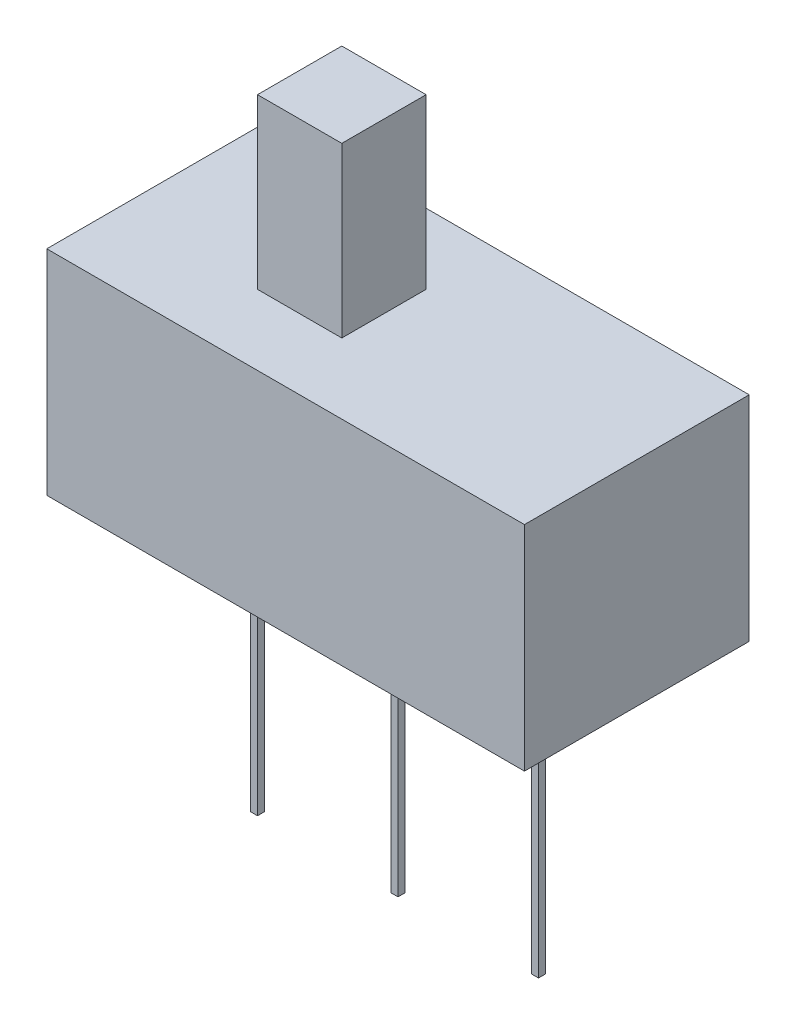
ISO-10303-21;
HEADER;
FILE_DESCRIPTION(('STEP AP214'),'2;1');
FILE_NAME('part.step','',(''),(''),'','','');
FILE_SCHEMA(('AUTOMOTIVE_DESIGN { 1 0 10303 214 1 1 1 1 }'));
ENDSEC;
DATA;
#1=APPLICATION_CONTEXT('core data for automotive mechanical design processes');
#2=APPLICATION_PROTOCOL_DEFINITION('international standard','automotive_design',2000,#1);
#3=PRODUCT_CONTEXT('',#1,'mechanical');
#4=PRODUCT('Part','Part','',(#3));
#5=PRODUCT_RELATED_PRODUCT_CATEGORY('part','',(#4));
#6=PRODUCT_DEFINITION_FORMATION('','',#4);
#7=PRODUCT_DEFINITION_CONTEXT('part definition',#1,'design');
#8=PRODUCT_DEFINITION('design','',#6,#7);
#9=PRODUCT_DEFINITION_SHAPE('','',#8);
#10=(LENGTH_UNIT() NAMED_UNIT(*) SI_UNIT(.MILLI.,.METRE.));
#11=(NAMED_UNIT(*) PLANE_ANGLE_UNIT() SI_UNIT($,.RADIAN.));
#12=(NAMED_UNIT(*) SI_UNIT($,.STERADIAN.) SOLID_ANGLE_UNIT());
#13=UNCERTAINTY_MEASURE_WITH_UNIT(LENGTH_MEASURE(1.E-05),#10,'distance_accuracy_value','');
#14=(GEOMETRIC_REPRESENTATION_CONTEXT(3) GLOBAL_UNCERTAINTY_ASSIGNED_CONTEXT((#13)) GLOBAL_UNIT_ASSIGNED_CONTEXT((#10,
#11,#12)) REPRESENTATION_CONTEXT('',''));
#15=CARTESIAN_POINT('',(0.,0.,0.));
#16=DIRECTION('',(0.,0.,1.));
#17=DIRECTION('',(1.,0.,0.));
#18=AXIS2_PLACEMENT_3D('',#15,#16,#17);
#19=CARTESIAN_POINT('',(-4.25,-1.9,2.));
#20=DIRECTION('',(0.,1.,0.));
#21=DIRECTION('',(0.,0.,1.));
#22=AXIS2_PLACEMENT_3D('',#19,#20,#21);
#23=PLANE('',#22);
#24=DIRECTION('',(0.,0.,1.));
#25=VECTOR('',#24,1.);
#26=CARTESIAN_POINT('',(2.5625,-1.9,0.0625));
#27=LINE('',#26,#25);
#28=CARTESIAN_POINT('',(2.5625,-1.9,-0.0625));
#29=VERTEX_POINT('',#28);
#30=CARTESIAN_POINT('',(2.5625,-1.9,0.0625000000000001));
#31=VERTEX_POINT('',#30);
#32=EDGE_CURVE('E191',#29,#31,#27,.T.);
#33=ORIENTED_EDGE('',*,*,#32,.F.);
#34=DIRECTION('',(1.,0.,0.));
#35=VECTOR('',#34,1.);
#36=CARTESIAN_POINT('',(2.4375,-1.9,-0.0625));
#37=LINE('',#36,#35);
#38=CARTESIAN_POINT('',(2.4375,-1.9,-0.0625000000000001));
#39=VERTEX_POINT('',#38);
#40=EDGE_CURVE('E204',#39,#29,#37,.T.);
#41=ORIENTED_EDGE('',*,*,#40,.F.);
#42=DIRECTION('',(0.,0.,-1.));
#43=VECTOR('',#42,1.);
#44=CARTESIAN_POINT('',(2.4375,-1.9,0.0625));
#45=LINE('',#44,#43);
#46=CARTESIAN_POINT('',(2.4375,-1.9,0.0625000000000001));
#47=VERTEX_POINT('',#46);
#48=EDGE_CURVE('E213',#47,#39,#45,.T.);
#49=ORIENTED_EDGE('',*,*,#48,.F.);
#50=DIRECTION('',(-1.,0.,0.));
#51=VECTOR('',#50,1.);
#52=CARTESIAN_POINT('',(2.4375,-1.9,0.0625));
#53=LINE('',#52,#51);
#54=EDGE_CURVE('E194',#31,#47,#53,.T.);
#55=ORIENTED_EDGE('',*,*,#54,.F.);
#56=EDGE_LOOP('',(#33,#41,#49,#55));
#57=FACE_BOUND('',#56,.T.);
#58=DIRECTION('',(1.,0.,0.));
#59=VECTOR('',#58,1.);
#60=CARTESIAN_POINT('',(-4.25,-1.9,-2.));
#61=LINE('',#60,#59);
#62=CARTESIAN_POINT('',(-4.25,-1.9,-2.));
#63=VERTEX_POINT('',#62);
#64=CARTESIAN_POINT('',(4.25,-1.9,-2.));
#65=VERTEX_POINT('',#64);
#66=EDGE_CURVE('E300',#63,#65,#61,.T.);
#67=ORIENTED_EDGE('',*,*,#66,.T.);
#68=DIRECTION('',(0.,0.,-1.));
#69=VECTOR('',#68,1.);
#70=CARTESIAN_POINT('',(4.25,-1.9,2.));
#71=LINE('',#70,#69);
#72=CARTESIAN_POINT('',(4.25,-1.9,2.));
#73=VERTEX_POINT('',#72);
#74=EDGE_CURVE('E306',#73,#65,#71,.T.);
#75=ORIENTED_EDGE('',*,*,#74,.F.);
#76=DIRECTION('',(1.,0.,0.));
#77=VECTOR('',#76,1.);
#78=CARTESIAN_POINT('',(-4.25,-1.9,2.));
#79=LINE('',#78,#77);
#80=CARTESIAN_POINT('',(-4.25,-1.9,2.));
#81=VERTEX_POINT('',#80);
#82=EDGE_CURVE('E304',#81,#73,#79,.T.);
#83=ORIENTED_EDGE('',*,*,#82,.F.);
#84=DIRECTION('',(0.,0.,-1.));
#85=VECTOR('',#84,1.);
#86=CARTESIAN_POINT('',(-4.25,-1.9,2.));
#87=LINE('',#86,#85);
#88=EDGE_CURVE('E316',#81,#63,#87,.T.);
#89=ORIENTED_EDGE('',*,*,#88,.T.);
#90=EDGE_LOOP('',(#67,#75,#83,#89));
#91=FACE_BOUND('',#90,.T.);
#92=DIRECTION('',(0.,0.,1.));
#93=VECTOR('',#92,1.);
#94=CARTESIAN_POINT('',(0.0625000000000001,-1.9,0.0625000000000001));
#95=LINE('',#94,#93);
#96=CARTESIAN_POINT('',(0.0625000000000001,-1.9,-0.0625000000000001));
#97=VERTEX_POINT('',#96);
#98=CARTESIAN_POINT('',(0.0625000000000001,-1.9,0.0625000000000001));
#99=VERTEX_POINT('',#98);
#100=EDGE_CURVE('E229',#97,#99,#95,.T.);
#101=ORIENTED_EDGE('',*,*,#100,.F.);
#102=DIRECTION('',(1.,0.,0.));
#103=VECTOR('',#102,1.);
#104=CARTESIAN_POINT('',(-0.0625000000000001,-1.9,-0.0625000000000001));
#105=LINE('',#104,#103);
#106=CARTESIAN_POINT('',(-0.0625000000000001,-1.9,-0.0625000000000001));
#107=VERTEX_POINT('',#106);
#108=EDGE_CURVE('E234',#107,#97,#105,.T.);
#109=ORIENTED_EDGE('',*,*,#108,.F.);
#110=DIRECTION('',(0.,0.,-1.));
#111=VECTOR('',#110,1.);
#112=CARTESIAN_POINT('',(-0.0625000000000001,-1.9,0.0625000000000001));
#113=LINE('',#112,#111);
#114=CARTESIAN_POINT('',(-0.0625000000000001,-1.9,0.0625000000000001));
#115=VERTEX_POINT('',#114);
#116=EDGE_CURVE('E246',#115,#107,#113,.T.);
#117=ORIENTED_EDGE('',*,*,#116,.F.);
#118=DIRECTION('',(-1.,0.,0.));
#119=VECTOR('',#118,1.);
#120=CARTESIAN_POINT('',(-0.0625000000000001,-1.9,0.0625000000000001));
#121=LINE('',#120,#119);
#122=EDGE_CURVE('E243',#99,#115,#121,.T.);
#123=ORIENTED_EDGE('',*,*,#122,.F.);
#124=EDGE_LOOP('',(#101,#109,#117,#123));
#125=FACE_BOUND('',#124,.T.);
#126=DIRECTION('',(0.,0.,1.));
#127=VECTOR('',#126,1.);
#128=CARTESIAN_POINT('',(-2.4375,-1.9,0.0625));
#129=LINE('',#128,#127);
#130=CARTESIAN_POINT('',(-2.4375,-1.9,-0.0625));
#131=VERTEX_POINT('',#130);
#132=CARTESIAN_POINT('',(-2.4375,-1.9,0.0625000000000001));
#133=VERTEX_POINT('',#132);
#134=EDGE_CURVE('E190',#131,#133,#129,.T.);
#135=ORIENTED_EDGE('',*,*,#134,.F.);
#136=DIRECTION('',(1.,0.,0.));
#137=VECTOR('',#136,1.);
#138=CARTESIAN_POINT('',(-2.5625,-1.9,-0.0625));
#139=LINE('',#138,#137);
#140=CARTESIAN_POINT('',(-2.5625,-1.9,-0.0625000000000001));
#141=VERTEX_POINT('',#140);
#142=EDGE_CURVE('E187',#141,#131,#139,.T.);
#143=ORIENTED_EDGE('',*,*,#142,.F.);
#144=DIRECTION('',(0.,0.,-1.));
#145=VECTOR('',#144,1.);
#146=CARTESIAN_POINT('',(-2.5625,-1.9,0.0625));
#147=LINE('',#146,#145);
#148=CARTESIAN_POINT('',(-2.5625,-1.9,0.0625000000000001));
#149=VERTEX_POINT('',#148);
#150=EDGE_CURVE('E53',#149,#141,#147,.T.);
#151=ORIENTED_EDGE('',*,*,#150,.F.);
#152=DIRECTION('',(-1.,0.,0.));
#153=VECTOR('',#152,1.);
#154=CARTESIAN_POINT('',(-2.5625,-1.9,0.0625));
#155=LINE('',#154,#153);
#156=EDGE_CURVE('E48',#133,#149,#155,.T.);
#157=ORIENTED_EDGE('',*,*,#156,.F.);
#158=EDGE_LOOP('',(#135,#143,#151,#157));
#159=FACE_BOUND('',#158,.T.);
#160=ADVANCED_FACE('F33',(#57,#91,#125,#159),#23,.F.);
#161=CARTESIAN_POINT('',(-4.25,1.9,2.));
#162=DIRECTION('',(0.,-1.,0.));
#163=DIRECTION('',(0.,0.,-1.));
#164=AXIS2_PLACEMENT_3D('',#161,#162,#163);
#165=PLANE('',#164);
#166=DIRECTION('',(-1.,0.,0.));
#167=VECTOR('',#166,1.);
#168=CARTESIAN_POINT('',(-4.25,1.9,-2.));
#169=LINE('',#168,#167);
#170=CARTESIAN_POINT('',(4.25,1.9,-2.));
#171=VERTEX_POINT('',#170);
#172=CARTESIAN_POINT('',(-4.25,1.9,-2.));
#173=VERTEX_POINT('',#172);
#174=EDGE_CURVE('E309',#171,#173,#169,.T.);
#175=ORIENTED_EDGE('',*,*,#174,.T.);
#176=DIRECTION('',(0.,0.,-1.));
#177=VECTOR('',#176,1.);
#178=CARTESIAN_POINT('',(-4.25,1.9,2.));
#179=LINE('',#178,#177);
#180=CARTESIAN_POINT('',(-4.25,1.9,2.));
#181=VERTEX_POINT('',#180);
#182=EDGE_CURVE('E41',#181,#173,#179,.T.);
#183=ORIENTED_EDGE('',*,*,#182,.F.);
#184=DIRECTION('',(-1.,0.,0.));
#185=VECTOR('',#184,1.);
#186=CARTESIAN_POINT('',(-4.25,1.9,2.));
#187=LINE('',#186,#185);
#188=CARTESIAN_POINT('',(4.25,1.9,2.));
#189=VERTEX_POINT('',#188);
#190=EDGE_CURVE('E299',#189,#181,#187,.T.);
#191=ORIENTED_EDGE('',*,*,#190,.F.);
#192=DIRECTION('',(0.,0.,-1.));
#193=VECTOR('',#192,1.);
#194=CARTESIAN_POINT('',(4.25,1.9,2.));
#195=LINE('',#194,#193);
#196=EDGE_CURVE('E11',#189,#171,#195,.T.);
#197=ORIENTED_EDGE('',*,*,#196,.T.);
#198=EDGE_LOOP('',(#175,#183,#191,#197));
#199=FACE_BOUND('',#198,.T.);
#200=DIRECTION('',(0.,0.,-1.));
#201=VECTOR('',#200,1.);
#202=CARTESIAN_POINT('',(-0.249999999999998,1.9,-0.75));
#203=LINE('',#202,#201);
#204=CARTESIAN_POINT('',(-0.249999999999998,1.9,0.75));
#205=VERTEX_POINT('',#204);
#206=CARTESIAN_POINT('',(-0.249999999999998,1.9,-0.75));
#207=VERTEX_POINT('',#206);
#208=EDGE_CURVE('E262',#205,#207,#203,.T.);
#209=ORIENTED_EDGE('',*,*,#208,.F.);
#210=DIRECTION('',(1.,0.,0.));
#211=VECTOR('',#210,1.);
#212=CARTESIAN_POINT('',(-1.75,1.9,0.75));
#213=LINE('',#212,#211);
#214=CARTESIAN_POINT('',(-1.75,1.9,0.75));
#215=VERTEX_POINT('',#214);
#216=EDGE_CURVE('E267',#215,#205,#213,.T.);
#217=ORIENTED_EDGE('',*,*,#216,.F.);
#218=DIRECTION('',(0.,0.,1.));
#219=VECTOR('',#218,1.);
#220=CARTESIAN_POINT('',(-1.75,1.9,-0.75));
#221=LINE('',#220,#219);
#222=CARTESIAN_POINT('',(-1.75,1.9,-0.75));
#223=VERTEX_POINT('',#222);
#224=EDGE_CURVE('E279',#223,#215,#221,.T.);
#225=ORIENTED_EDGE('',*,*,#224,.F.);
#226=DIRECTION('',(-1.,0.,0.));
#227=VECTOR('',#226,1.);
#228=CARTESIAN_POINT('',(-1.75,1.9,-0.75));
#229=LINE('',#228,#227);
#230=EDGE_CURVE('E276',#207,#223,#229,.T.);
#231=ORIENTED_EDGE('',*,*,#230,.F.);
#232=EDGE_LOOP('',(#209,#217,#225,#231));
#233=FACE_BOUND('',#232,.T.);
#234=ADVANCED_FACE('F339',(#199,#233),#165,.F.);
#235=CARTESIAN_POINT('',(4.25,1.9,2.));
#236=DIRECTION('',(-1.,0.,0.));
#237=DIRECTION('',(0.,0.,1.));
#238=AXIS2_PLACEMENT_3D('',#235,#236,#237);
#239=PLANE('',#238);
#240=DIRECTION('',(0.,1.,0.));
#241=VECTOR('',#240,1.);
#242=CARTESIAN_POINT('',(4.25,1.9,-2.));
#243=LINE('',#242,#241);
#244=EDGE_CURVE('E295',#65,#171,#243,.T.);
#245=ORIENTED_EDGE('',*,*,#244,.T.);
#246=ORIENTED_EDGE('',*,*,#196,.F.);
#247=DIRECTION('',(0.,1.,0.));
#248=VECTOR('',#247,1.);
#249=CARTESIAN_POINT('',(4.25,1.9,2.));
#250=LINE('',#249,#248);
#251=EDGE_CURVE('E296',#73,#189,#250,.T.);
#252=ORIENTED_EDGE('',*,*,#251,.F.);
#253=ORIENTED_EDGE('',*,*,#74,.T.);
#254=EDGE_LOOP('',(#245,#246,#252,#253));
#255=FACE_BOUND('',#254,.T.);
#256=ADVANCED_FACE('F35',(#255),#239,.F.);
#257=CARTESIAN_POINT('',(-4.25,1.9,2.));
#258=DIRECTION('',(1.,0.,0.));
#259=DIRECTION('',(0.,0.,-1.));
#260=AXIS2_PLACEMENT_3D('',#257,#258,#259);
#261=PLANE('',#260);
#262=DIRECTION('',(0.,-1.,0.));
#263=VECTOR('',#262,1.);
#264=CARTESIAN_POINT('',(-4.25,1.9,-2.));
#265=LINE('',#264,#263);
#266=EDGE_CURVE('E311',#173,#63,#265,.T.);
#267=ORIENTED_EDGE('',*,*,#266,.T.);
#268=ORIENTED_EDGE('',*,*,#88,.F.);
#269=DIRECTION('',(0.,-1.,0.));
#270=VECTOR('',#269,1.);
#271=CARTESIAN_POINT('',(-4.25,1.9,2.));
#272=LINE('',#271,#270);
#273=EDGE_CURVE('E302',#181,#81,#272,.T.);
#274=ORIENTED_EDGE('',*,*,#273,.F.);
#275=ORIENTED_EDGE('',*,*,#182,.T.);
#276=EDGE_LOOP('',(#267,#268,#274,#275));
#277=FACE_BOUND('',#276,.T.);
#278=ADVANCED_FACE('F323',(#277),#261,.F.);
#279=CARTESIAN_POINT('',(0.,0.,2.));
#280=DIRECTION('',(0.,0.,1.));
#281=DIRECTION('',(1.,0.,0.));
#282=AXIS2_PLACEMENT_3D('',#279,#280,#281);
#283=PLANE('',#282);
#284=ORIENTED_EDGE('',*,*,#251,.T.);
#285=ORIENTED_EDGE('',*,*,#190,.T.);
#286=ORIENTED_EDGE('',*,*,#273,.T.);
#287=ORIENTED_EDGE('',*,*,#82,.T.);
#288=EDGE_LOOP('',(#284,#285,#286,#287));
#289=FACE_BOUND('',#288,.T.);
#290=ADVANCED_FACE('F338',(#289),#283,.T.);
#291=CARTESIAN_POINT('',(0.,0.,-2.));
#292=DIRECTION('',(0.,0.,1.));
#293=DIRECTION('',(1.,0.,0.));
#294=AXIS2_PLACEMENT_3D('',#291,#292,#293);
#295=PLANE('',#294);
#296=ORIENTED_EDGE('',*,*,#244,.F.);
#297=ORIENTED_EDGE('',*,*,#66,.F.);
#298=ORIENTED_EDGE('',*,*,#266,.F.);
#299=ORIENTED_EDGE('',*,*,#174,.F.);
#300=EDGE_LOOP('',(#296,#297,#298,#299));
#301=FACE_BOUND('',#300,.T.);
#302=ADVANCED_FACE('F329',(#301),#295,.F.);
#303=CARTESIAN_POINT('',(-0.249999999999998,4.9,-0.75));
#304=DIRECTION('',(-1.,0.,0.));
#305=DIRECTION('',(0.,0.,1.));
#306=AXIS2_PLACEMENT_3D('',#303,#304,#305);
#307=PLANE('',#306);
#308=ORIENTED_EDGE('',*,*,#208,.T.);
#309=DIRECTION('',(0.,-1.,0.));
#310=VECTOR('',#309,1.);
#311=CARTESIAN_POINT('',(-0.249999999999998,4.9,-0.75));
#312=LINE('',#311,#310);
#313=CARTESIAN_POINT('',(-0.249999999999998,4.9,-0.75));
#314=VERTEX_POINT('',#313);
#315=EDGE_CURVE('E292',#314,#207,#312,.T.);
#316=ORIENTED_EDGE('',*,*,#315,.F.);
#317=DIRECTION('',(0.,0.,-1.));
#318=VECTOR('',#317,1.);
#319=CARTESIAN_POINT('',(-0.249999999999998,4.9,-0.75));
#320=LINE('',#319,#318);
#321=CARTESIAN_POINT('',(-0.249999999999998,4.9,0.75));
#322=VERTEX_POINT('',#321);
#323=EDGE_CURVE('E263',#322,#314,#320,.T.);
#324=ORIENTED_EDGE('',*,*,#323,.F.);
#325=DIRECTION('',(0.,-1.,0.));
#326=VECTOR('',#325,1.);
#327=CARTESIAN_POINT('',(-0.249999999999998,4.9,0.75));
#328=LINE('',#327,#326);
#329=EDGE_CURVE('E273',#322,#205,#328,.T.);
#330=ORIENTED_EDGE('',*,*,#329,.T.);
#331=EDGE_LOOP('',(#308,#316,#324,#330));
#332=FACE_BOUND('',#331,.T.);
#333=ADVANCED_FACE('F350',(#332),#307,.F.);
#334=CARTESIAN_POINT('',(-1.75,4.9,-0.75));
#335=DIRECTION('',(0.,0.,1.));
#336=DIRECTION('',(1.,0.,0.));
#337=AXIS2_PLACEMENT_3D('',#334,#335,#336);
#338=PLANE('',#337);
#339=ORIENTED_EDGE('',*,*,#230,.T.);
#340=DIRECTION('',(0.,-1.,0.));
#341=VECTOR('',#340,1.);
#342=CARTESIAN_POINT('',(-1.75,4.9,-0.75));
#343=LINE('',#342,#341);
#344=CARTESIAN_POINT('',(-1.75,4.9,-0.75));
#345=VERTEX_POINT('',#344);
#346=EDGE_CURVE('E289',#345,#223,#343,.T.);
#347=ORIENTED_EDGE('',*,*,#346,.F.);
#348=DIRECTION('',(-1.,0.,0.));
#349=VECTOR('',#348,1.);
#350=CARTESIAN_POINT('',(-1.75,4.9,-0.75));
#351=LINE('',#350,#349);
#352=EDGE_CURVE('E266',#314,#345,#351,.T.);
#353=ORIENTED_EDGE('',*,*,#352,.F.);
#354=ORIENTED_EDGE('',*,*,#315,.T.);
#355=EDGE_LOOP('',(#339,#347,#353,#354));
#356=FACE_BOUND('',#355,.T.);
#357=ADVANCED_FACE('F358',(#356),#338,.F.);
#358=CARTESIAN_POINT('',(-1.75,4.9,-0.75));
#359=DIRECTION('',(1.,0.,0.));
#360=DIRECTION('',(0.,0.,-1.));
#361=AXIS2_PLACEMENT_3D('',#358,#359,#360);
#362=PLANE('',#361);
#363=ORIENTED_EDGE('',*,*,#224,.T.);
#364=DIRECTION('',(0.,-1.,0.));
#365=VECTOR('',#364,1.);
#366=CARTESIAN_POINT('',(-1.75,4.9,0.75));
#367=LINE('',#366,#365);
#368=CARTESIAN_POINT('',(-1.75,4.9,0.75));
#369=VERTEX_POINT('',#368);
#370=EDGE_CURVE('E286',#369,#215,#367,.T.);
#371=ORIENTED_EDGE('',*,*,#370,.F.);
#372=DIRECTION('',(0.,0.,1.));
#373=VECTOR('',#372,1.);
#374=CARTESIAN_POINT('',(-1.75,4.9,-0.75));
#375=LINE('',#374,#373);
#376=EDGE_CURVE('E269',#345,#369,#375,.T.);
#377=ORIENTED_EDGE('',*,*,#376,.F.);
#378=ORIENTED_EDGE('',*,*,#346,.T.);
#379=EDGE_LOOP('',(#363,#371,#377,#378));
#380=FACE_BOUND('',#379,.T.);
#381=ADVANCED_FACE('F356',(#380),#362,.F.);
#382=CARTESIAN_POINT('',(-1.75,4.9,0.75));
#383=DIRECTION('',(0.,0.,-1.));
#384=DIRECTION('',(-1.,0.,0.));
#385=AXIS2_PLACEMENT_3D('',#382,#383,#384);
#386=PLANE('',#385);
#387=ORIENTED_EDGE('',*,*,#216,.T.);
#388=ORIENTED_EDGE('',*,*,#329,.F.);
#389=DIRECTION('',(1.,0.,0.));
#390=VECTOR('',#389,1.);
#391=CARTESIAN_POINT('',(-1.75,4.9,0.75));
#392=LINE('',#391,#390);
#393=EDGE_CURVE('E271',#369,#322,#392,.T.);
#394=ORIENTED_EDGE('',*,*,#393,.F.);
#395=ORIENTED_EDGE('',*,*,#370,.T.);
#396=EDGE_LOOP('',(#387,#388,#394,#395));
#397=FACE_BOUND('',#396,.T.);
#398=ADVANCED_FACE('F346',(#397),#386,.F.);
#399=CARTESIAN_POINT('',(0.,4.9,0.));
#400=DIRECTION('',(0.,1.,0.));
#401=DIRECTION('',(0.,0.,1.));
#402=AXIS2_PLACEMENT_3D('',#399,#400,#401);
#403=PLANE('',#402);
#404=ORIENTED_EDGE('',*,*,#323,.T.);
#405=ORIENTED_EDGE('',*,*,#352,.T.);
#406=ORIENTED_EDGE('',*,*,#376,.T.);
#407=ORIENTED_EDGE('',*,*,#393,.T.);
#408=EDGE_LOOP('',(#404,#405,#406,#407));
#409=FACE_BOUND('',#408,.T.);
#410=ADVANCED_FACE('F352',(#409),#403,.T.);
#411=CARTESIAN_POINT('',(0.0625000000000001,-6.9,0.0625000000000001));
#412=DIRECTION('',(-1.,0.,0.));
#413=DIRECTION('',(0.,0.,1.));
#414=AXIS2_PLACEMENT_3D('',#411,#412,#413);
#415=PLANE('',#414);
#416=ORIENTED_EDGE('',*,*,#100,.T.);
#417=DIRECTION('',(0.,1.,0.));
#418=VECTOR('',#417,1.);
#419=CARTESIAN_POINT('',(0.0625000000000001,-6.9,0.0625000000000001));
#420=LINE('',#419,#418);
#421=CARTESIAN_POINT('',(0.0625000000000001,-6.9,0.0625000000000001));
#422=VERTEX_POINT('',#421);
#423=EDGE_CURVE('E259',#422,#99,#420,.T.);
#424=ORIENTED_EDGE('',*,*,#423,.F.);
#425=DIRECTION('',(0.,0.,1.));
#426=VECTOR('',#425,1.);
#427=CARTESIAN_POINT('',(0.0625000000000001,-6.9,0.0625000000000001));
#428=LINE('',#427,#426);
#429=CARTESIAN_POINT('',(0.0625000000000001,-6.9,-0.0625000000000001));
#430=VERTEX_POINT('',#429);
#431=EDGE_CURVE('E230',#430,#422,#428,.T.);
#432=ORIENTED_EDGE('',*,*,#431,.F.);
#433=DIRECTION('',(0.,1.,0.));
#434=VECTOR('',#433,1.);
#435=CARTESIAN_POINT('',(0.0625000000000001,-6.9,-0.0625000000000001));
#436=LINE('',#435,#434);
#437=EDGE_CURVE('E240',#430,#97,#436,.T.);
#438=ORIENTED_EDGE('',*,*,#437,.T.);
#439=EDGE_LOOP('',(#416,#424,#432,#438));
#440=FACE_BOUND('',#439,.T.);
#441=ADVANCED_FACE('F423',(#440),#415,.F.);
#442=CARTESIAN_POINT('',(-0.0625000000000001,-6.9,0.0625000000000001));
#443=DIRECTION('',(0.,0.,-1.));
#444=DIRECTION('',(-1.,0.,0.));
#445=AXIS2_PLACEMENT_3D('',#442,#443,#444);
#446=PLANE('',#445);
#447=ORIENTED_EDGE('',*,*,#122,.T.);
#448=DIRECTION('',(0.,1.,0.));
#449=VECTOR('',#448,1.);
#450=CARTESIAN_POINT('',(-0.0625000000000001,-6.9,0.0625000000000001));
#451=LINE('',#450,#449);
#452=CARTESIAN_POINT('',(-0.0625000000000001,-6.9,0.0625000000000001));
#453=VERTEX_POINT('',#452);
#454=EDGE_CURVE('E256',#453,#115,#451,.T.);
#455=ORIENTED_EDGE('',*,*,#454,.F.);
#456=DIRECTION('',(-1.,0.,0.));
#457=VECTOR('',#456,1.);
#458=CARTESIAN_POINT('',(-0.0625000000000001,-6.9,0.0625000000000001));
#459=LINE('',#458,#457);
#460=EDGE_CURVE('E233',#422,#453,#459,.T.);
#461=ORIENTED_EDGE('',*,*,#460,.F.);
#462=ORIENTED_EDGE('',*,*,#423,.T.);
#463=EDGE_LOOP('',(#447,#455,#461,#462));
#464=FACE_BOUND('',#463,.T.);
#465=ADVANCED_FACE('F437',(#464),#446,.F.);
#466=CARTESIAN_POINT('',(-0.0625000000000001,-6.9,0.0625000000000001));
#467=DIRECTION('',(1.,0.,0.));
#468=DIRECTION('',(0.,0.,-1.));
#469=AXIS2_PLACEMENT_3D('',#466,#467,#468);
#470=PLANE('',#469);
#471=ORIENTED_EDGE('',*,*,#116,.T.);
#472=DIRECTION('',(0.,1.,0.));
#473=VECTOR('',#472,1.);
#474=CARTESIAN_POINT('',(-0.0625000000000001,-6.9,-0.0625000000000001));
#475=LINE('',#474,#473);
#476=CARTESIAN_POINT('',(-0.0625000000000001,-6.9,-0.0625000000000001));
#477=VERTEX_POINT('',#476);
#478=EDGE_CURVE('E253',#477,#107,#475,.T.);
#479=ORIENTED_EDGE('',*,*,#478,.F.);
#480=DIRECTION('',(0.,0.,-1.));
#481=VECTOR('',#480,1.);
#482=CARTESIAN_POINT('',(-0.0625000000000001,-6.9,0.0625000000000001));
#483=LINE('',#482,#481);
#484=EDGE_CURVE('E236',#453,#477,#483,.T.);
#485=ORIENTED_EDGE('',*,*,#484,.F.);
#486=ORIENTED_EDGE('',*,*,#454,.T.);
#487=EDGE_LOOP('',(#471,#479,#485,#486));
#488=FACE_BOUND('',#487,.T.);
#489=ADVANCED_FACE('F447',(#488),#470,.F.);
#490=CARTESIAN_POINT('',(-0.0625000000000001,-6.9,-0.0625000000000001));
#491=DIRECTION('',(0.,0.,1.));
#492=DIRECTION('',(1.,0.,0.));
#493=AXIS2_PLACEMENT_3D('',#490,#491,#492);
#494=PLANE('',#493);
#495=ORIENTED_EDGE('',*,*,#108,.T.);
#496=ORIENTED_EDGE('',*,*,#437,.F.);
#497=DIRECTION('',(1.,0.,0.));
#498=VECTOR('',#497,1.);
#499=CARTESIAN_POINT('',(-0.0625000000000001,-6.9,-0.0625000000000001));
#500=LINE('',#499,#498);
#501=EDGE_CURVE('E238',#477,#430,#500,.T.);
#502=ORIENTED_EDGE('',*,*,#501,.F.);
#503=ORIENTED_EDGE('',*,*,#478,.T.);
#504=EDGE_LOOP('',(#495,#496,#502,#503));
#505=FACE_BOUND('',#504,.T.);
#506=ADVANCED_FACE('F457',(#505),#494,.F.);
#507=CARTESIAN_POINT('',(0.,-6.9,0.));
#508=DIRECTION('',(0.,-1.,0.));
#509=DIRECTION('',(0.,0.,-1.));
#510=AXIS2_PLACEMENT_3D('',#507,#508,#509);
#511=PLANE('',#510);
#512=ORIENTED_EDGE('',*,*,#431,.T.);
#513=ORIENTED_EDGE('',*,*,#460,.T.);
#514=ORIENTED_EDGE('',*,*,#484,.T.);
#515=ORIENTED_EDGE('',*,*,#501,.T.);
#516=EDGE_LOOP('',(#512,#513,#514,#515));
#517=FACE_BOUND('',#516,.T.);
#518=ADVANCED_FACE('F467',(#517),#511,.T.);
#519=CARTESIAN_POINT('',(2.5625,-6.9,0.0625));
#520=DIRECTION('',(-1.,0.,0.));
#521=DIRECTION('',(0.,0.,1.));
#522=AXIS2_PLACEMENT_3D('',#519,#520,#521);
#523=PLANE('',#522);
#524=ORIENTED_EDGE('',*,*,#32,.T.);
#525=DIRECTION('',(0.,1.,0.));
#526=VECTOR('',#525,1.);
#527=CARTESIAN_POINT('',(2.5625,-6.9,0.0625));
#528=LINE('',#527,#526);
#529=CARTESIAN_POINT('',(2.5625,-6.9,0.0625));
#530=VERTEX_POINT('',#529);
#531=EDGE_CURVE('E226',#530,#31,#528,.T.);
#532=ORIENTED_EDGE('',*,*,#531,.F.);
#533=DIRECTION('',(0.,0.,1.));
#534=VECTOR('',#533,1.);
#535=CARTESIAN_POINT('',(2.5625,-6.9,0.0625));
#536=LINE('',#535,#534);
#537=CARTESIAN_POINT('',(2.5625,-6.9,-0.0625));
#538=VERTEX_POINT('',#537);
#539=EDGE_CURVE('E200',#538,#530,#536,.T.);
#540=ORIENTED_EDGE('',*,*,#539,.F.);
#541=DIRECTION('',(0.,1.,0.));
#542=VECTOR('',#541,1.);
#543=CARTESIAN_POINT('',(2.5625,-6.9,-0.0625));
#544=LINE('',#543,#542);
#545=EDGE_CURVE('E209',#538,#29,#544,.T.);
#546=ORIENTED_EDGE('',*,*,#545,.T.);
#547=EDGE_LOOP('',(#524,#532,#540,#546));
#548=FACE_BOUND('',#547,.T.);
#549=ADVANCED_FACE('F477',(#548),#523,.F.);
#550=CARTESIAN_POINT('',(2.4375,-6.9,0.0625));
#551=DIRECTION('',(0.,0.,-1.));
#552=DIRECTION('',(-1.,0.,0.));
#553=AXIS2_PLACEMENT_3D('',#550,#551,#552);
#554=PLANE('',#553);
#555=ORIENTED_EDGE('',*,*,#54,.T.);
#556=DIRECTION('',(0.,1.,0.));
#557=VECTOR('',#556,1.);
#558=CARTESIAN_POINT('',(2.4375,-6.9,0.0625));
#559=LINE('',#558,#557);
#560=CARTESIAN_POINT('',(2.4375,-6.9,0.0625));
#561=VERTEX_POINT('',#560);
#562=EDGE_CURVE('E223',#561,#47,#559,.T.);
#563=ORIENTED_EDGE('',*,*,#562,.F.);
#564=DIRECTION('',(-1.,0.,0.));
#565=VECTOR('',#564,1.);
#566=CARTESIAN_POINT('',(2.4375,-6.9,0.0625));
#567=LINE('',#566,#565);
#568=EDGE_CURVE('E203',#530,#561,#567,.T.);
#569=ORIENTED_EDGE('',*,*,#568,.F.);
#570=ORIENTED_EDGE('',*,*,#531,.T.);
#571=EDGE_LOOP('',(#555,#563,#569,#570));
#572=FACE_BOUND('',#571,.T.);
#573=ADVANCED_FACE('F487',(#572),#554,.F.);
#574=CARTESIAN_POINT('',(2.4375,-6.9,0.0625));
#575=DIRECTION('',(1.,0.,0.));
#576=DIRECTION('',(0.,0.,-1.));
#577=AXIS2_PLACEMENT_3D('',#574,#575,#576);
#578=PLANE('',#577);
#579=ORIENTED_EDGE('',*,*,#48,.T.);
#580=DIRECTION('',(0.,1.,0.));
#581=VECTOR('',#580,1.);
#582=CARTESIAN_POINT('',(2.4375,-6.9,-0.0625));
#583=LINE('',#582,#581);
#584=CARTESIAN_POINT('',(2.4375,-6.9,-0.0625));
#585=VERTEX_POINT('',#584);
#586=EDGE_CURVE('E220',#585,#39,#583,.T.);
#587=ORIENTED_EDGE('',*,*,#586,.F.);
#588=DIRECTION('',(0.,0.,-1.));
#589=VECTOR('',#588,1.);
#590=CARTESIAN_POINT('',(2.4375,-6.9,0.0625));
#591=LINE('',#590,#589);
#592=EDGE_CURVE('E206',#561,#585,#591,.T.);
#593=ORIENTED_EDGE('',*,*,#592,.F.);
#594=ORIENTED_EDGE('',*,*,#562,.T.);
#595=EDGE_LOOP('',(#579,#587,#593,#594));
#596=FACE_BOUND('',#595,.T.);
#597=ADVANCED_FACE('F497',(#596),#578,.F.);
#598=CARTESIAN_POINT('',(2.4375,-6.9,-0.0625));
#599=DIRECTION('',(0.,0.,1.));
#600=DIRECTION('',(1.,0.,0.));
#601=AXIS2_PLACEMENT_3D('',#598,#599,#600);
#602=PLANE('',#601);
#603=ORIENTED_EDGE('',*,*,#40,.T.);
#604=ORIENTED_EDGE('',*,*,#545,.F.);
#605=DIRECTION('',(1.,0.,0.));
#606=VECTOR('',#605,1.);
#607=CARTESIAN_POINT('',(2.4375,-6.9,-0.0625));
#608=LINE('',#607,#606);
#609=EDGE_CURVE('E208',#585,#538,#608,.T.);
#610=ORIENTED_EDGE('',*,*,#609,.F.);
#611=ORIENTED_EDGE('',*,*,#586,.T.);
#612=EDGE_LOOP('',(#603,#604,#610,#611));
#613=FACE_BOUND('',#612,.T.);
#614=ADVANCED_FACE('F507',(#613),#602,.F.);
#615=CARTESIAN_POINT('',(0.,-6.9,0.));
#616=DIRECTION('',(0.,-1.,0.));
#617=DIRECTION('',(0.,0.,-1.));
#618=AXIS2_PLACEMENT_3D('',#615,#616,#617);
#619=PLANE('',#618);
#620=ORIENTED_EDGE('',*,*,#539,.T.);
#621=ORIENTED_EDGE('',*,*,#568,.T.);
#622=ORIENTED_EDGE('',*,*,#592,.T.);
#623=ORIENTED_EDGE('',*,*,#609,.T.);
#624=EDGE_LOOP('',(#620,#621,#622,#623));
#625=FACE_BOUND('',#624,.T.);
#626=ADVANCED_FACE('F517',(#625),#619,.T.);
#627=CARTESIAN_POINT('',(-2.4375,-6.9,0.0625));
#628=DIRECTION('',(-1.,0.,0.));
#629=DIRECTION('',(0.,0.,1.));
#630=AXIS2_PLACEMENT_3D('',#627,#628,#629);
#631=PLANE('',#630);
#632=ORIENTED_EDGE('',*,*,#134,.T.);
#633=DIRECTION('',(0.,1.,0.));
#634=VECTOR('',#633,1.);
#635=CARTESIAN_POINT('',(-2.4375,-6.9,0.0625));
#636=LINE('',#635,#634);
#637=CARTESIAN_POINT('',(-2.4375,-6.9,0.0625));
#638=VERTEX_POINT('',#637);
#639=EDGE_CURVE('E171',#638,#133,#636,.T.);
#640=ORIENTED_EDGE('',*,*,#639,.F.);
#641=DIRECTION('',(0.,0.,1.));
#642=VECTOR('',#641,1.);
#643=CARTESIAN_POINT('',(-2.4375,-6.9,0.0625));
#644=LINE('',#643,#642);
#645=CARTESIAN_POINT('',(-2.4375,-6.9,-0.0625));
#646=VERTEX_POINT('',#645);
#647=EDGE_CURVE('E178',#646,#638,#644,.T.);
#648=ORIENTED_EDGE('',*,*,#647,.F.);
#649=DIRECTION('',(0.,1.,0.));
#650=VECTOR('',#649,1.);
#651=CARTESIAN_POINT('',(-2.4375,-6.9,-0.0625));
#652=LINE('',#651,#650);
#653=EDGE_CURVE('E577',#646,#131,#652,.T.);
#654=ORIENTED_EDGE('',*,*,#653,.T.);
#655=EDGE_LOOP('',(#632,#640,#648,#654));
#656=FACE_BOUND('',#655,.T.);
#657=ADVANCED_FACE('F189',(#656),#631,.F.);
#658=CARTESIAN_POINT('',(-2.5625,-6.9,0.0625));
#659=DIRECTION('',(0.,0.,-1.));
#660=DIRECTION('',(-1.,0.,0.));
#661=AXIS2_PLACEMENT_3D('',#658,#659,#660);
#662=PLANE('',#661);
#663=ORIENTED_EDGE('',*,*,#156,.T.);
#664=DIRECTION('',(0.,1.,0.));
#665=VECTOR('',#664,1.);
#666=CARTESIAN_POINT('',(-2.5625,-6.9,0.0625));
#667=LINE('',#666,#665);
#668=CARTESIAN_POINT('',(-2.5625,-6.9,0.0625));
#669=VERTEX_POINT('',#668);
#670=EDGE_CURVE('E174',#669,#149,#667,.T.);
#671=ORIENTED_EDGE('',*,*,#670,.F.);
#672=DIRECTION('',(-1.,0.,0.));
#673=VECTOR('',#672,1.);
#674=CARTESIAN_POINT('',(-2.5625,-6.9,0.0625));
#675=LINE('',#674,#673);
#676=EDGE_CURVE('E167',#638,#669,#675,.T.);
#677=ORIENTED_EDGE('',*,*,#676,.F.);
#678=ORIENTED_EDGE('',*,*,#639,.T.);
#679=EDGE_LOOP('',(#663,#671,#677,#678));
#680=FACE_BOUND('',#679,.T.);
#681=ADVANCED_FACE('F169',(#680),#662,.F.);
#682=CARTESIAN_POINT('',(-2.5625,-6.9,0.0625));
#683=DIRECTION('',(1.,0.,0.));
#684=DIRECTION('',(0.,0.,-1.));
#685=AXIS2_PLACEMENT_3D('',#682,#683,#684);
#686=PLANE('',#685);
#687=ORIENTED_EDGE('',*,*,#150,.T.);
#688=DIRECTION('',(0.,1.,0.));
#689=VECTOR('',#688,1.);
#690=CARTESIAN_POINT('',(-2.5625,-6.9,-0.0625));
#691=LINE('',#690,#689);
#692=CARTESIAN_POINT('',(-2.5625,-6.9,-0.0625));
#693=VERTEX_POINT('',#692);
#694=EDGE_CURVE('E196',#693,#141,#691,.T.);
#695=ORIENTED_EDGE('',*,*,#694,.F.);
#696=DIRECTION('',(0.,0.,-1.));
#697=VECTOR('',#696,1.);
#698=CARTESIAN_POINT('',(-2.5625,-6.9,0.0625));
#699=LINE('',#698,#697);
#700=EDGE_CURVE('E177',#669,#693,#699,.T.);
#701=ORIENTED_EDGE('',*,*,#700,.F.);
#702=ORIENTED_EDGE('',*,*,#670,.T.);
#703=EDGE_LOOP('',(#687,#695,#701,#702));
#704=FACE_BOUND('',#703,.T.);
#705=ADVANCED_FACE('F544',(#704),#686,.F.);
#706=CARTESIAN_POINT('',(-2.5625,-6.9,-0.0625));
#707=DIRECTION('',(0.,0.,1.));
#708=DIRECTION('',(1.,0.,0.));
#709=AXIS2_PLACEMENT_3D('',#706,#707,#708);
#710=PLANE('',#709);
#711=ORIENTED_EDGE('',*,*,#142,.T.);
#712=ORIENTED_EDGE('',*,*,#653,.F.);
#713=DIRECTION('',(1.,0.,0.));
#714=VECTOR('',#713,1.);
#715=CARTESIAN_POINT('',(-2.5625,-6.9,-0.0625));
#716=LINE('',#715,#714);
#717=EDGE_CURVE('E183',#693,#646,#716,.T.);
#718=ORIENTED_EDGE('',*,*,#717,.F.);
#719=ORIENTED_EDGE('',*,*,#694,.T.);
#720=EDGE_LOOP('',(#711,#712,#718,#719));
#721=FACE_BOUND('',#720,.T.);
#722=ADVANCED_FACE('F553',(#721),#710,.F.);
#723=CARTESIAN_POINT('',(0.,-6.9,0.));
#724=DIRECTION('',(0.,-1.,0.));
#725=DIRECTION('',(0.,0.,-1.));
#726=AXIS2_PLACEMENT_3D('',#723,#724,#725);
#727=PLANE('',#726);
#728=ORIENTED_EDGE('',*,*,#647,.T.);
#729=ORIENTED_EDGE('',*,*,#676,.T.);
#730=ORIENTED_EDGE('',*,*,#700,.T.);
#731=ORIENTED_EDGE('',*,*,#717,.T.);
#732=EDGE_LOOP('',(#728,#729,#730,#731));
#733=FACE_BOUND('',#732,.T.);
#734=ADVANCED_FACE('F181',(#733),#727,.T.);
#735=CLOSED_SHELL('',(#160,#234,#256,#278,#290,#302,#333,#357,#381,#398,#410,#441,#465,#489,
#506,#518,#549,#573,#597,#614,#626,#657,#681,#705,#722,#734));
#736=MANIFOLD_SOLID_BREP('B2',#735);
#737=ADVANCED_BREP_SHAPE_REPRESENTATION('',(#18,#736),#14);
#738=SHAPE_DEFINITION_REPRESENTATION(#9,#737);
ENDSEC;
END-ISO-10303-21;
